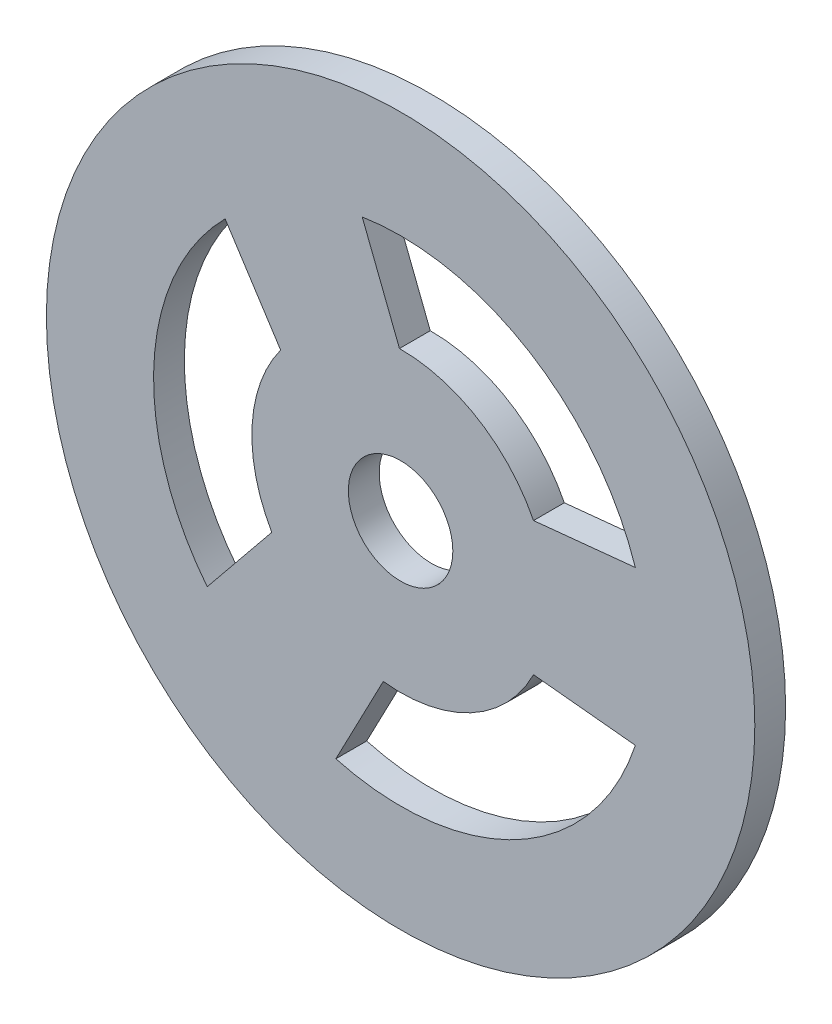
ISO-10303-21;
HEADER;
FILE_DESCRIPTION(('STEP AP214'),'2;1');
FILE_NAME('part.step','',(''),(''),'','','');
FILE_SCHEMA(('AUTOMOTIVE_DESIGN { 1 0 10303 214 1 1 1 1 }'));
ENDSEC;
DATA;
#1=APPLICATION_CONTEXT('core data for automotive mechanical design processes');
#2=APPLICATION_PROTOCOL_DEFINITION('international standard','automotive_design',2000,#1);
#3=PRODUCT_CONTEXT('',#1,'mechanical');
#4=PRODUCT('Part','Part','',(#3));
#5=PRODUCT_RELATED_PRODUCT_CATEGORY('part','',(#4));
#6=PRODUCT_DEFINITION_FORMATION('','',#4);
#7=PRODUCT_DEFINITION_CONTEXT('part definition',#1,'design');
#8=PRODUCT_DEFINITION('design','',#6,#7);
#9=PRODUCT_DEFINITION_SHAPE('','',#8);
#10=(LENGTH_UNIT() NAMED_UNIT(*) SI_UNIT(.MILLI.,.METRE.));
#11=(NAMED_UNIT(*) PLANE_ANGLE_UNIT() SI_UNIT($,.RADIAN.));
#12=(NAMED_UNIT(*) SI_UNIT($,.STERADIAN.) SOLID_ANGLE_UNIT());
#13=UNCERTAINTY_MEASURE_WITH_UNIT(LENGTH_MEASURE(1.E-05),#10,'distance_accuracy_value','');
#14=(GEOMETRIC_REPRESENTATION_CONTEXT(3) GLOBAL_UNCERTAINTY_ASSIGNED_CONTEXT((#13)) GLOBAL_UNIT_ASSIGNED_CONTEXT((#10,
#11,#12)) REPRESENTATION_CONTEXT('',''));
#15=CARTESIAN_POINT('',(0.,0.,0.));
#16=DIRECTION('',(0.,0.,1.));
#17=DIRECTION('',(1.,0.,0.));
#18=AXIS2_PLACEMENT_3D('',#15,#16,#17);
#19=CARTESIAN_POINT('',(255.493849665995,-76.5806122425344,3.));
#20=DIRECTION('',(0.,0.,1.));
#21=DIRECTION('',(1.,0.,0.));
#22=AXIS2_PLACEMENT_3D('',#19,#20,#21);
#23=PLANE('',#22);
#24=DIRECTION('',(0.994953479662544,0.100337297688321,0.));
#25=VECTOR('',#24,1.);
#26=CARTESIAN_POINT('',(278.355317346375,-69.0805641801,3.));
#27=LINE('',#26,#25);
#28=CARTESIAN_POINT('',(268.439022561395,-70.0805850274497,3.));
#29=VERTEX_POINT('',#28);
#30=CARTESIAN_POINT('',(278.355317346375,-69.0805641801,3.));
#31=VERTEX_POINT('',#30);
#32=EDGE_CURVE('E156',#29,#31,#27,.T.);
#33=ORIENTED_EDGE('',*,*,#32,.F.);
#34=CARTESIAN_POINT('',(255.493849665995,-76.5806122425344,3.));
#35=DIRECTION('',(0.,0.,-1.));
#36=DIRECTION('',(1.,0.,0.));
#37=AXIS2_PLACEMENT_3D('',#34,#35,#36);
#38=CIRCLE('',#37,14.4854359647257);
#39=CARTESIAN_POINT('',(255.382868285553,-62.095601430633,3.));
#40=VERTEX_POINT('',#39);
#41=EDGE_CURVE('E139',#40,#29,#38,.T.);
#42=ORIENTED_EDGE('',*,*,#41,.F.);
#43=DIRECTION('',(0.363942528658473,-0.931421406149588,0.));
#44=VECTOR('',#43,1.);
#45=CARTESIAN_POINT('',(251.755601812568,-52.8125048626089,3.));
#46=LINE('',#45,#44);
#47=CARTESIAN_POINT('',(251.755601812558,-52.8125048625828,3.));
#48=VERTEX_POINT('',#47);
#49=EDGE_CURVE('E160',#48,#40,#46,.T.);
#50=ORIENTED_EDGE('',*,*,#49,.F.);
#51=CARTESIAN_POINT('',(255.493849665995,-76.5806122425344,3.));
#52=DIRECTION('',(0.,0.,1.));
#53=DIRECTION('',(1.,0.,0.));
#54=AXIS2_PLACEMENT_3D('',#51,#52,#53);
#55=CIRCLE('',#54,24.0602873099761);
#56=EDGE_CURVE('E158',#31,#48,#55,.T.);
#57=ORIENTED_EDGE('',*,*,#56,.F.);
#58=EDGE_LOOP('',(#33,#42,#50,#57));
#59=FACE_BOUND('',#58,.T.);
#60=DIRECTION('',(0.630869720506526,0.775888777949532,0.));
#61=VECTOR('',#60,1.);
#62=CARTESIAN_POINT('',(242.9468375791,-83.8194203473961,3.));
#63=LINE('',#62,#61);
#64=CARTESIAN_POINT('',(236.659216853789,-91.5523867621652,3.));
#65=VERTEX_POINT('',#64);
#66=CARTESIAN_POINT('',(242.9468375791,-83.8194203473961,3.));
#67=VERTEX_POINT('',#66);
#68=EDGE_CURVE('E210',#65,#67,#63,.T.);
#69=ORIENTED_EDGE('',*,*,#68,.F.);
#70=CARTESIAN_POINT('',(255.493849665995,-76.5806122425344,3.));
#71=DIRECTION('',(0.,0.,1.));
#72=DIRECTION('',(1.,0.,0.));
#73=AXIS2_PLACEMENT_3D('',#70,#71,#72);
#74=CIRCLE('',#73,24.0602873099493);
#75=CARTESIAN_POINT('',(238.402528057833,-59.6459096728496,3.));
#76=VERTEX_POINT('',#75);
#77=EDGE_CURVE('E208',#76,#65,#74,.T.);
#78=ORIENTED_EDGE('',*,*,#77,.F.);
#79=DIRECTION('',(-0.54258031605217,0.840003928938864,0.));
#80=VECTOR('',#79,1.);
#81=CARTESIAN_POINT('',(238.402528057833,-59.6459096728496,3.));
#82=LINE('',#81,#80);
#83=CARTESIAN_POINT('',(243.810204364784,-68.0178855995087,3.));
#84=VERTEX_POINT('',#83);
#85=EDGE_CURVE('E215',#84,#76,#82,.T.);
#86=ORIENTED_EDGE('',*,*,#85,.F.);
#87=CARTESIAN_POINT('',(255.493849665995,-76.5806122425344,3.));
#88=DIRECTION('',(0.,0.,-1.));
#89=DIRECTION('',(1.,0.,0.));
#90=AXIS2_PLACEMENT_3D('',#87,#88,#89);
#91=CIRCLE('',#90,14.4854359647097);
#92=EDGE_CURVE('E212',#67,#84,#91,.T.);
#93=ORIENTED_EDGE('',*,*,#92,.F.);
#94=EDGE_LOOP('',(#69,#78,#86,#93));
#95=FACE_BOUND('',#94,.T.);
#96=CARTESIAN_POINT('',(255.493849665995,-76.5806122425344,3.));
#97=DIRECTION('',(0.,0.,1.));
#98=DIRECTION('',(1.,0.,0.));
#99=AXIS2_PLACEMENT_3D('',#96,#97,#98);
#100=CIRCLE('',#99,34.5);
#101=CARTESIAN_POINT('',(289.993849665995,-76.5806122425344,3.));
#102=VERTEX_POINT('',#101);
#103=EDGE_CURVE('E11',#102,#102,#100,.T.);
#104=ORIENTED_EDGE('',*,*,#103,.T.);
#105=EDGE_LOOP('',(#104));
#106=FACE_BOUND('',#105,.T.);
#107=DIRECTION('',(-0.463255375002821,-0.886224834639041,0.));
#108=VECTOR('',#107,1.);
#109=CARTESIAN_POINT('',(253.805371583113,-90.9673039001509,3.));
#110=LINE('',#109,#108);
#111=CARTESIAN_POINT('',(253.805371583113,-90.9673039001509,3.));
#112=VERTEX_POINT('',#111);
#113=CARTESIAN_POINT('',(249.188294550725,-99.7999447076505,3.));
#114=VERTEX_POINT('',#113);
#115=EDGE_CURVE('E179',#112,#114,#110,.T.);
#116=ORIENTED_EDGE('',*,*,#115,.F.);
#117=CARTESIAN_POINT('',(255.493849665995,-76.5806122425344,3.));
#118=DIRECTION('',(0.,0.,-1.));
#119=DIRECTION('',(1.,0.,0.));
#120=AXIS2_PLACEMENT_3D('',#117,#118,#119);
#121=CIRCLE('',#120,14.4854359647256);
#122=CARTESIAN_POINT('',(268.439049891715,-83.0805850274496,3.));
#123=VERTEX_POINT('',#122);
#124=EDGE_CURVE('E177',#123,#112,#121,.T.);
#125=ORIENTED_EDGE('',*,*,#124,.F.);
#126=DIRECTION('',(-0.994953901538398,0.100333114242101,0.));
#127=VECTOR('',#126,1.);
#128=CARTESIAN_POINT('',(268.439049891715,-83.0805850274496,3.));
#129=LINE('',#128,#127);
#130=CARTESIAN_POINT('',(278.355348881334,-84.0805641800976,3.));
#131=VERTEX_POINT('',#130);
#132=EDGE_CURVE('E184',#131,#123,#129,.T.);
#133=ORIENTED_EDGE('',*,*,#132,.F.);
#134=CARTESIAN_POINT('',(255.493849665995,-76.5806122425344,3.));
#135=DIRECTION('',(0.,0.,1.));
#136=DIRECTION('',(1.,0.,0.));
#137=AXIS2_PLACEMENT_3D('',#134,#135,#136);
#138=CIRCLE('',#137,24.0602873099759);
#139=EDGE_CURVE('E181',#114,#131,#138,.T.);
#140=ORIENTED_EDGE('',*,*,#139,.F.);
#141=EDGE_LOOP('',(#116,#125,#133,#140));
#142=FACE_BOUND('',#141,.T.);
#143=CARTESIAN_POINT('',(255.493849665995,-76.5806122425344,3.));
#144=DIRECTION('',(0.,0.,1.));
#145=DIRECTION('',(1.,0.,0.));
#146=AXIS2_PLACEMENT_3D('',#143,#144,#145);
#147=CIRCLE('',#146,5.08712269756894);
#148=CARTESIAN_POINT('',(260.580972363564,-76.5806122425344,3.));
#149=VERTEX_POINT('',#148);
#150=EDGE_CURVE('E146',#149,#149,#147,.T.);
#151=ORIENTED_EDGE('',*,*,#150,.F.);
#152=EDGE_LOOP('',(#151));
#153=FACE_BOUND('',#152,.T.);
#154=ADVANCED_FACE('F35',(#59,#95,#106,#142,#153),#23,.T.);
#155=CARTESIAN_POINT('',(255.493849665995,-76.5806122425344,0.));
#156=DIRECTION('',(0.,0.,1.));
#157=DIRECTION('',(1.,0.,0.));
#158=AXIS2_PLACEMENT_3D('',#155,#156,#157);
#159=PLANE('',#158);
#160=CARTESIAN_POINT('',(255.493849665995,-76.5806122425344,0.));
#161=DIRECTION('',(0.,0.,-1.));
#162=DIRECTION('',(1.,0.,0.));
#163=AXIS2_PLACEMENT_3D('',#160,#161,#162);
#164=CIRCLE('',#163,14.4854359647257);
#165=CARTESIAN_POINT('',(255.382868285553,-62.095601430633,0.));
#166=VERTEX_POINT('',#165);
#167=CARTESIAN_POINT('',(268.439022561395,-70.0805850274497,0.));
#168=VERTEX_POINT('',#167);
#169=EDGE_CURVE('E58',#166,#168,#164,.T.);
#170=ORIENTED_EDGE('',*,*,#169,.T.);
#171=DIRECTION('',(0.994953479662544,0.100337297688321,0.));
#172=VECTOR('',#171,1.);
#173=CARTESIAN_POINT('',(278.355317346375,-69.0805641801,0.));
#174=LINE('',#173,#172);
#175=CARTESIAN_POINT('',(278.355317346375,-69.0805641801,0.));
#176=VERTEX_POINT('',#175);
#177=EDGE_CURVE('E126',#168,#176,#174,.T.);
#178=ORIENTED_EDGE('',*,*,#177,.T.);
#179=CARTESIAN_POINT('',(255.493849665995,-76.5806122425344,0.));
#180=DIRECTION('',(0.,0.,1.));
#181=DIRECTION('',(1.,0.,0.));
#182=AXIS2_PLACEMENT_3D('',#179,#180,#181);
#183=CIRCLE('',#182,24.0602873099761);
#184=CARTESIAN_POINT('',(251.755601812564,-52.8125048625828,0.));
#185=VERTEX_POINT('',#184);
#186=EDGE_CURVE('E135',#176,#185,#183,.T.);
#187=ORIENTED_EDGE('',*,*,#186,.T.);
#188=DIRECTION('',(0.363942528658473,-0.931421406149588,0.));
#189=VECTOR('',#188,1.);
#190=CARTESIAN_POINT('',(251.755601812568,-52.8125048626089,0.));
#191=LINE('',#190,#189);
#192=EDGE_CURVE('E145',#185,#166,#191,.T.);
#193=ORIENTED_EDGE('',*,*,#192,.T.);
#194=EDGE_LOOP('',(#170,#178,#187,#193));
#195=FACE_BOUND('',#194,.T.);
#196=CARTESIAN_POINT('',(255.493849665995,-76.5806122425344,0.));
#197=DIRECTION('',(0.,0.,1.));
#198=DIRECTION('',(1.,0.,0.));
#199=AXIS2_PLACEMENT_3D('',#196,#197,#198);
#200=CIRCLE('',#199,24.0602873099493);
#201=CARTESIAN_POINT('',(238.402528057833,-59.6459096728495,0.));
#202=VERTEX_POINT('',#201);
#203=CARTESIAN_POINT('',(236.659216853789,-91.5523867621652,0.));
#204=VERTEX_POINT('',#203);
#205=EDGE_CURVE('E196',#202,#204,#200,.T.);
#206=ORIENTED_EDGE('',*,*,#205,.T.);
#207=DIRECTION('',(0.630869720506526,0.775888777949532,0.));
#208=VECTOR('',#207,1.);
#209=CARTESIAN_POINT('',(242.9468375791,-83.8194203473961,0.));
#210=LINE('',#209,#208);
#211=CARTESIAN_POINT('',(242.9468375791,-83.8194203473961,0.));
#212=VERTEX_POINT('',#211);
#213=EDGE_CURVE('E199',#204,#212,#210,.T.);
#214=ORIENTED_EDGE('',*,*,#213,.T.);
#215=CARTESIAN_POINT('',(255.493849665995,-76.5806122425344,0.));
#216=DIRECTION('',(0.,0.,-1.));
#217=DIRECTION('',(1.,0.,0.));
#218=AXIS2_PLACEMENT_3D('',#215,#216,#217);
#219=CIRCLE('',#218,14.4854359647097);
#220=CARTESIAN_POINT('',(243.810204364784,-68.0178855995087,0.));
#221=VERTEX_POINT('',#220);
#222=EDGE_CURVE('E202',#212,#221,#219,.T.);
#223=ORIENTED_EDGE('',*,*,#222,.T.);
#224=DIRECTION('',(-0.54258031605217,0.840003928938864,0.));
#225=VECTOR('',#224,1.);
#226=CARTESIAN_POINT('',(238.402528057833,-59.6459096728496,0.));
#227=LINE('',#226,#225);
#228=EDGE_CURVE('E205',#221,#202,#227,.T.);
#229=ORIENTED_EDGE('',*,*,#228,.T.);
#230=EDGE_LOOP('',(#206,#214,#223,#229));
#231=FACE_BOUND('',#230,.T.);
#232=CARTESIAN_POINT('',(255.493849665995,-76.5806122425344,0.));
#233=DIRECTION('',(0.,0.,1.));
#234=DIRECTION('',(1.,0.,0.));
#235=AXIS2_PLACEMENT_3D('',#232,#233,#234);
#236=CIRCLE('',#235,34.5);
#237=CARTESIAN_POINT('',(289.993849665995,-76.5806122425344,0.));
#238=VERTEX_POINT('',#237);
#239=EDGE_CURVE('E43',#238,#238,#236,.T.);
#240=ORIENTED_EDGE('',*,*,#239,.F.);
#241=EDGE_LOOP('',(#240));
#242=FACE_BOUND('',#241,.T.);
#243=CARTESIAN_POINT('',(255.493849665995,-76.5806122425344,0.));
#244=DIRECTION('',(0.,0.,-1.));
#245=DIRECTION('',(1.,0.,0.));
#246=AXIS2_PLACEMENT_3D('',#243,#244,#245);
#247=CIRCLE('',#246,14.4854359647256);
#248=CARTESIAN_POINT('',(268.439049891715,-83.0805850274496,0.));
#249=VERTEX_POINT('',#248);
#250=CARTESIAN_POINT('',(253.805371583113,-90.9673039001509,0.));
#251=VERTEX_POINT('',#250);
#252=EDGE_CURVE('E140',#249,#251,#247,.T.);
#253=ORIENTED_EDGE('',*,*,#252,.T.);
#254=DIRECTION('',(-0.463255375002821,-0.886224834639041,0.));
#255=VECTOR('',#254,1.);
#256=CARTESIAN_POINT('',(253.805371583113,-90.9673039001509,0.));
#257=LINE('',#256,#255);
#258=CARTESIAN_POINT('',(249.188294550725,-99.7999447076505,0.));
#259=VERTEX_POINT('',#258);
#260=EDGE_CURVE('E168',#251,#259,#257,.T.);
#261=ORIENTED_EDGE('',*,*,#260,.T.);
#262=CARTESIAN_POINT('',(255.493849665995,-76.5806122425344,0.));
#263=DIRECTION('',(0.,0.,1.));
#264=DIRECTION('',(1.,0.,0.));
#265=AXIS2_PLACEMENT_3D('',#262,#263,#264);
#266=CIRCLE('',#265,24.0602873099759);
#267=CARTESIAN_POINT('',(278.355348881334,-84.0805641800918,0.));
#268=VERTEX_POINT('',#267);
#269=EDGE_CURVE('E171',#259,#268,#266,.T.);
#270=ORIENTED_EDGE('',*,*,#269,.T.);
#271=DIRECTION('',(-0.994953901538398,0.100333114242101,0.));
#272=VECTOR('',#271,1.);
#273=CARTESIAN_POINT('',(268.439049891715,-83.0805850274496,0.));
#274=LINE('',#273,#272);
#275=EDGE_CURVE('E174',#268,#249,#274,.T.);
#276=ORIENTED_EDGE('',*,*,#275,.T.);
#277=EDGE_LOOP('',(#253,#261,#270,#276));
#278=FACE_BOUND('',#277,.T.);
#279=CARTESIAN_POINT('',(255.493849665995,-76.5806122425344,0.));
#280=DIRECTION('',(0.,0.,1.));
#281=DIRECTION('',(1.,0.,0.));
#282=AXIS2_PLACEMENT_3D('',#279,#280,#281);
#283=CIRCLE('',#282,5.08712269756894);
#284=CARTESIAN_POINT('',(260.580972363564,-76.5806122425344,0.));
#285=VERTEX_POINT('',#284);
#286=EDGE_CURVE('E149',#285,#285,#283,.T.);
#287=ORIENTED_EDGE('',*,*,#286,.T.);
#288=EDGE_LOOP('',(#287));
#289=FACE_BOUND('',#288,.T.);
#290=ADVANCED_FACE('F143',(#195,#231,#242,#278,#289),#159,.F.);
#291=CARTESIAN_POINT('',(255.493849665995,-76.5806122425344,3.));
#292=DIRECTION('',(0.,0.,-1.));
#293=DIRECTION('',(-1.,0.,0.));
#294=AXIS2_PLACEMENT_3D('',#291,#292,#293);
#295=CYLINDRICAL_SURFACE('',#294,34.5);
#296=ORIENTED_EDGE('',*,*,#103,.F.);
#297=EDGE_LOOP('',(#296));
#298=FACE_BOUND('',#297,.T.);
#299=ORIENTED_EDGE('',*,*,#239,.T.);
#300=EDGE_LOOP('',(#299));
#301=FACE_BOUND('',#300,.T.);
#302=ADVANCED_FACE('F37',(#298,#301),#295,.T.);
#303=CARTESIAN_POINT('',(255.493849665995,-76.5806122425344,3.));
#304=DIRECTION('',(0.,0.,-1.));
#305=DIRECTION('',(-1.,0.,0.));
#306=AXIS2_PLACEMENT_3D('',#303,#304,#305);
#307=CYLINDRICAL_SURFACE('',#306,24.0602873099493);
#308=ORIENTED_EDGE('',*,*,#205,.F.);
#309=DIRECTION('',(0.,0.,-1.));
#310=VECTOR('',#309,1.);
#311=CARTESIAN_POINT('',(238.402528057833,-59.6459096728496,3.));
#312=LINE('',#311,#310);
#313=EDGE_CURVE('E217',#76,#202,#312,.T.);
#314=ORIENTED_EDGE('',*,*,#313,.F.);
#315=ORIENTED_EDGE('',*,*,#77,.T.);
#316=DIRECTION('',(0.,0.,-1.));
#317=VECTOR('',#316,1.);
#318=CARTESIAN_POINT('',(236.659216853789,-91.5523867621652,3.));
#319=LINE('',#318,#317);
#320=EDGE_CURVE('E224',#65,#204,#319,.T.);
#321=ORIENTED_EDGE('',*,*,#320,.T.);
#322=EDGE_LOOP('',(#308,#314,#315,#321));
#323=FACE_BOUND('',#322,.T.);
#324=ADVANCED_FACE('F253',(#323),#307,.F.);
#325=CARTESIAN_POINT('',(242.9468375791,-83.8194203473961,3.));
#326=DIRECTION('',(-0.775888777949532,0.630869720506526,0.));
#327=DIRECTION('',(-0.630869720506526,-0.775888777949532,0.));
#328=AXIS2_PLACEMENT_3D('',#325,#326,#327);
#329=PLANE('',#328);
#330=ORIENTED_EDGE('',*,*,#213,.F.);
#331=ORIENTED_EDGE('',*,*,#320,.F.);
#332=ORIENTED_EDGE('',*,*,#68,.T.);
#333=DIRECTION('',(0.,0.,-1.));
#334=VECTOR('',#333,1.);
#335=CARTESIAN_POINT('',(242.9468375791,-83.8194203473961,3.));
#336=LINE('',#335,#334);
#337=EDGE_CURVE('E222',#67,#212,#336,.T.);
#338=ORIENTED_EDGE('',*,*,#337,.T.);
#339=EDGE_LOOP('',(#330,#331,#332,#338));
#340=FACE_BOUND('',#339,.T.);
#341=ADVANCED_FACE('F256',(#340),#329,.T.);
#342=CARTESIAN_POINT('',(255.493849665995,-76.5806122425344,3.));
#343=DIRECTION('',(0.,0.,-1.));
#344=DIRECTION('',(-1.,0.,0.));
#345=AXIS2_PLACEMENT_3D('',#342,#343,#344);
#346=CYLINDRICAL_SURFACE('',#345,14.4854359647097);
#347=ORIENTED_EDGE('',*,*,#222,.F.);
#348=ORIENTED_EDGE('',*,*,#337,.F.);
#349=ORIENTED_EDGE('',*,*,#92,.T.);
#350=DIRECTION('',(0.,0.,-1.));
#351=VECTOR('',#350,1.);
#352=CARTESIAN_POINT('',(243.810204364784,-68.0178855995087,3.));
#353=LINE('',#352,#351);
#354=EDGE_CURVE('E220',#84,#221,#353,.T.);
#355=ORIENTED_EDGE('',*,*,#354,.T.);
#356=EDGE_LOOP('',(#347,#348,#349,#355));
#357=FACE_BOUND('',#356,.T.);
#358=ADVANCED_FACE('F260',(#357),#346,.T.);
#359=CARTESIAN_POINT('',(238.402528057833,-59.6459096728496,3.));
#360=DIRECTION('',(-0.840003928938864,-0.54258031605217,0.));
#361=DIRECTION('',(0.54258031605217,-0.840003928938864,0.));
#362=AXIS2_PLACEMENT_3D('',#359,#360,#361);
#363=PLANE('',#362);
#364=ORIENTED_EDGE('',*,*,#228,.F.);
#365=ORIENTED_EDGE('',*,*,#354,.F.);
#366=ORIENTED_EDGE('',*,*,#85,.T.);
#367=ORIENTED_EDGE('',*,*,#313,.T.);
#368=EDGE_LOOP('',(#364,#365,#366,#367));
#369=FACE_BOUND('',#368,.T.);
#370=ADVANCED_FACE('F264',(#369),#363,.T.);
#371=CARTESIAN_POINT('',(255.493849665995,-76.5806122425344,3.));
#372=DIRECTION('',(0.,0.,-1.));
#373=DIRECTION('',(-1.,0.,0.));
#374=AXIS2_PLACEMENT_3D('',#371,#372,#373);
#375=CYLINDRICAL_SURFACE('',#374,14.4854359647256);
#376=ORIENTED_EDGE('',*,*,#252,.F.);
#377=DIRECTION('',(0.,0.,-1.));
#378=VECTOR('',#377,1.);
#379=CARTESIAN_POINT('',(268.439049891715,-83.0805850274496,3.));
#380=LINE('',#379,#378);
#381=EDGE_CURVE('E186',#123,#249,#380,.T.);
#382=ORIENTED_EDGE('',*,*,#381,.F.);
#383=ORIENTED_EDGE('',*,*,#124,.T.);
#384=DIRECTION('',(0.,0.,-1.));
#385=VECTOR('',#384,1.);
#386=CARTESIAN_POINT('',(253.805371583113,-90.9673039001509,3.));
#387=LINE('',#386,#385);
#388=EDGE_CURVE('E193',#112,#251,#387,.T.);
#389=ORIENTED_EDGE('',*,*,#388,.T.);
#390=EDGE_LOOP('',(#376,#382,#383,#389));
#391=FACE_BOUND('',#390,.T.);
#392=ADVANCED_FACE('F268',(#391),#375,.T.);
#393=CARTESIAN_POINT('',(253.805371583113,-90.9673039001509,3.));
#394=DIRECTION('',(0.886224834639041,-0.463255375002821,0.));
#395=DIRECTION('',(0.463255375002821,0.886224834639041,0.));
#396=AXIS2_PLACEMENT_3D('',#393,#394,#395);
#397=PLANE('',#396);
#398=ORIENTED_EDGE('',*,*,#260,.F.);
#399=ORIENTED_EDGE('',*,*,#388,.F.);
#400=ORIENTED_EDGE('',*,*,#115,.T.);
#401=DIRECTION('',(0.,0.,-1.));
#402=VECTOR('',#401,1.);
#403=CARTESIAN_POINT('',(249.188294550725,-99.7999447076505,3.));
#404=LINE('',#403,#402);
#405=EDGE_CURVE('E191',#114,#259,#404,.T.);
#406=ORIENTED_EDGE('',*,*,#405,.T.);
#407=EDGE_LOOP('',(#398,#399,#400,#406));
#408=FACE_BOUND('',#407,.T.);
#409=ADVANCED_FACE('F272',(#408),#397,.T.);
#410=CARTESIAN_POINT('',(255.493849665995,-76.5806122425344,3.));
#411=DIRECTION('',(0.,0.,-1.));
#412=DIRECTION('',(-1.,0.,0.));
#413=AXIS2_PLACEMENT_3D('',#410,#411,#412);
#414=CYLINDRICAL_SURFACE('',#413,24.0602873099759);
#415=ORIENTED_EDGE('',*,*,#269,.F.);
#416=ORIENTED_EDGE('',*,*,#405,.F.);
#417=ORIENTED_EDGE('',*,*,#139,.T.);
#418=DIRECTION('',(0.,0.,-1.));
#419=VECTOR('',#418,1.);
#420=CARTESIAN_POINT('',(278.355348881334,-84.0805641800918,3.));
#421=LINE('',#420,#419);
#422=EDGE_CURVE('E189',#131,#268,#421,.T.);
#423=ORIENTED_EDGE('',*,*,#422,.T.);
#424=EDGE_LOOP('',(#415,#416,#417,#423));
#425=FACE_BOUND('',#424,.T.);
#426=ADVANCED_FACE('F276',(#425),#414,.F.);
#427=CARTESIAN_POINT('',(268.439049891715,-83.0805850274496,3.));
#428=DIRECTION('',(-0.100333114242101,-0.994953901538399,0.));
#429=DIRECTION('',(0.994953901538399,-0.100333114242101,0.));
#430=AXIS2_PLACEMENT_3D('',#427,#428,#429);
#431=PLANE('',#430);
#432=ORIENTED_EDGE('',*,*,#275,.F.);
#433=ORIENTED_EDGE('',*,*,#422,.F.);
#434=ORIENTED_EDGE('',*,*,#132,.T.);
#435=ORIENTED_EDGE('',*,*,#381,.T.);
#436=EDGE_LOOP('',(#432,#433,#434,#435));
#437=FACE_BOUND('',#436,.T.);
#438=ADVANCED_FACE('F280',(#437),#431,.T.);
#439=CARTESIAN_POINT('',(255.493849665995,-76.5806122425344,3.));
#440=DIRECTION('',(0.,0.,-1.));
#441=DIRECTION('',(-1.,0.,0.));
#442=AXIS2_PLACEMENT_3D('',#439,#440,#441);
#443=CYLINDRICAL_SURFACE('',#442,14.4854359647257);
#444=ORIENTED_EDGE('',*,*,#169,.F.);
#445=DIRECTION('',(0.,0.,-1.));
#446=VECTOR('',#445,1.);
#447=CARTESIAN_POINT('',(255.382868285553,-62.095601430633,3.));
#448=LINE('',#447,#446);
#449=EDGE_CURVE('E162',#40,#166,#448,.T.);
#450=ORIENTED_EDGE('',*,*,#449,.F.);
#451=ORIENTED_EDGE('',*,*,#41,.T.);
#452=DIRECTION('',(0.,0.,-1.));
#453=VECTOR('',#452,1.);
#454=CARTESIAN_POINT('',(268.439022561395,-70.0805850274497,3.));
#455=LINE('',#454,#453);
#456=EDGE_CURVE('E128',#29,#168,#455,.T.);
#457=ORIENTED_EDGE('',*,*,#456,.T.);
#458=EDGE_LOOP('',(#444,#450,#451,#457));
#459=FACE_BOUND('',#458,.T.);
#460=ADVANCED_FACE('F137',(#459),#443,.T.);
#461=CARTESIAN_POINT('',(278.355317346375,-69.0805641801,3.));
#462=DIRECTION('',(-0.100337297688321,0.994953479662544,0.));
#463=DIRECTION('',(-0.994953479662544,-0.100337297688321,0.));
#464=AXIS2_PLACEMENT_3D('',#461,#462,#463);
#465=PLANE('',#464);
#466=ORIENTED_EDGE('',*,*,#177,.F.);
#467=ORIENTED_EDGE('',*,*,#456,.F.);
#468=ORIENTED_EDGE('',*,*,#32,.T.);
#469=DIRECTION('',(0.,0.,-1.));
#470=VECTOR('',#469,1.);
#471=CARTESIAN_POINT('',(278.355317346375,-69.0805641801,3.));
#472=LINE('',#471,#470);
#473=EDGE_CURVE('E131',#31,#176,#472,.T.);
#474=ORIENTED_EDGE('',*,*,#473,.T.);
#475=EDGE_LOOP('',(#466,#467,#468,#474));
#476=FACE_BOUND('',#475,.T.);
#477=ADVANCED_FACE('F127',(#476),#465,.T.);
#478=CARTESIAN_POINT('',(255.493849665995,-76.5806122425344,3.));
#479=DIRECTION('',(0.,0.,-1.));
#480=DIRECTION('',(-1.,0.,0.));
#481=AXIS2_PLACEMENT_3D('',#478,#479,#480);
#482=CYLINDRICAL_SURFACE('',#481,24.0602873099761);
#483=ORIENTED_EDGE('',*,*,#186,.F.);
#484=ORIENTED_EDGE('',*,*,#473,.F.);
#485=ORIENTED_EDGE('',*,*,#56,.T.);
#486=DIRECTION('',(0.,0.,-1.));
#487=VECTOR('',#486,1.);
#488=CARTESIAN_POINT('',(251.755601812564,-52.8125048625828,3.));
#489=LINE('',#488,#487);
#490=EDGE_CURVE('E50',#48,#185,#489,.T.);
#491=ORIENTED_EDGE('',*,*,#490,.T.);
#492=EDGE_LOOP('',(#483,#484,#485,#491));
#493=FACE_BOUND('',#492,.T.);
#494=ADVANCED_FACE('F245',(#493),#482,.F.);
#495=CARTESIAN_POINT('',(251.755601812568,-52.8125048626089,3.));
#496=DIRECTION('',(0.931421406149588,0.363942528658473,0.));
#497=DIRECTION('',(-0.363942528658473,0.931421406149588,0.));
#498=AXIS2_PLACEMENT_3D('',#495,#496,#497);
#499=PLANE('',#498);
#500=ORIENTED_EDGE('',*,*,#192,.F.);
#501=ORIENTED_EDGE('',*,*,#490,.F.);
#502=ORIENTED_EDGE('',*,*,#49,.T.);
#503=ORIENTED_EDGE('',*,*,#449,.T.);
#504=EDGE_LOOP('',(#500,#501,#502,#503));
#505=FACE_BOUND('',#504,.T.);
#506=ADVANCED_FACE('F239',(#505),#499,.T.);
#507=CARTESIAN_POINT('',(255.493849665995,-76.5806122425344,3.));
#508=DIRECTION('',(0.,0.,-1.));
#509=DIRECTION('',(-1.,0.,0.));
#510=AXIS2_PLACEMENT_3D('',#507,#508,#509);
#511=CYLINDRICAL_SURFACE('',#510,5.08712269756894);
#512=ORIENTED_EDGE('',*,*,#150,.T.);
#513=EDGE_LOOP('',(#512));
#514=FACE_BOUND('',#513,.T.);
#515=ORIENTED_EDGE('',*,*,#286,.F.);
#516=EDGE_LOOP('',(#515));
#517=FACE_BOUND('',#516,.T.);
#518=ADVANCED_FACE('F237',(#514,#517),#511,.F.);
#519=CLOSED_SHELL('',(#154,#290,#302,#324,#341,#358,#370,#392,#409,#426,#438,#460,#477,#494,
#506,#518));
#520=MANIFOLD_SOLID_BREP('B2',#519);
#521=ADVANCED_BREP_SHAPE_REPRESENTATION('',(#18,#520),#14);
#522=SHAPE_DEFINITION_REPRESENTATION(#9,#521);
ENDSEC;
END-ISO-10303-21;
